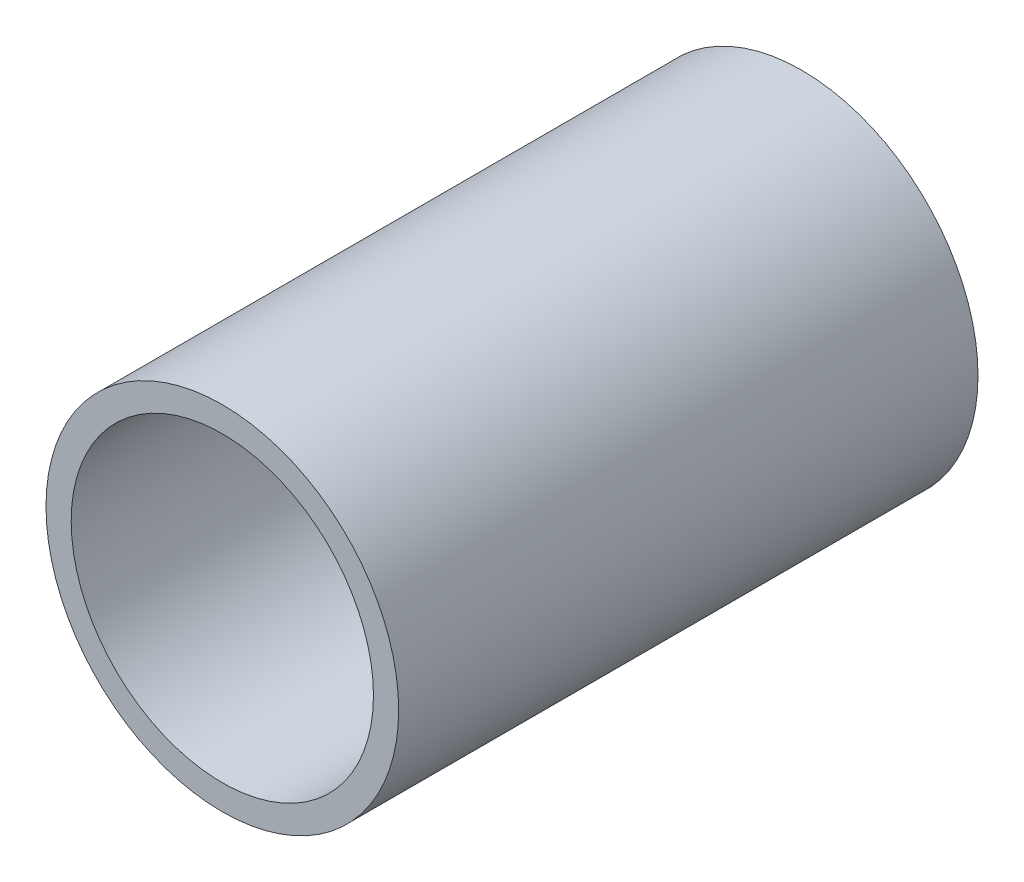
ISO-10303-21;
HEADER;
FILE_DESCRIPTION(('STEP AP214'),'2;1');
FILE_NAME('part.step','',(''),(''),'','','');
FILE_SCHEMA(('AUTOMOTIVE_DESIGN { 1 0 10303 214 1 1 1 1 }'));
ENDSEC;
DATA;
#1=APPLICATION_CONTEXT('core data for automotive mechanical design processes');
#2=APPLICATION_PROTOCOL_DEFINITION('international standard','automotive_design',2000,#1);
#3=PRODUCT_CONTEXT('',#1,'mechanical');
#4=PRODUCT('Part','Part','',(#3));
#5=PRODUCT_RELATED_PRODUCT_CATEGORY('part','',(#4));
#6=PRODUCT_DEFINITION_FORMATION('','',#4);
#7=PRODUCT_DEFINITION_CONTEXT('part definition',#1,'design');
#8=PRODUCT_DEFINITION('design','',#6,#7);
#9=PRODUCT_DEFINITION_SHAPE('','',#8);
#10=(LENGTH_UNIT() NAMED_UNIT(*) SI_UNIT(.MILLI.,.METRE.));
#11=(NAMED_UNIT(*) PLANE_ANGLE_UNIT() SI_UNIT($,.RADIAN.));
#12=(NAMED_UNIT(*) SI_UNIT($,.STERADIAN.) SOLID_ANGLE_UNIT());
#13=UNCERTAINTY_MEASURE_WITH_UNIT(LENGTH_MEASURE(1.E-05),#10,'distance_accuracy_value','');
#14=(GEOMETRIC_REPRESENTATION_CONTEXT(3) GLOBAL_UNCERTAINTY_ASSIGNED_CONTEXT((#13)) GLOBAL_UNIT_ASSIGNED_CONTEXT((#10,
#11,#12)) REPRESENTATION_CONTEXT('',''));
#15=CARTESIAN_POINT('',(0.,0.,0.));
#16=DIRECTION('',(0.,0.,1.));
#17=DIRECTION('',(1.,0.,0.));
#18=AXIS2_PLACEMENT_3D('',#15,#16,#17);
#19=CARTESIAN_POINT('',(0.,0.,914.4));
#20=DIRECTION('',(0.,0.,-1.));
#21=DIRECTION('',(-1.,0.,0.));
#22=AXIS2_PLACEMENT_3D('',#19,#20,#21);
#23=CYLINDRICAL_SURFACE('',#22,22.225);
#24=CARTESIAN_POINT('',(0.,0.,-914.4));
#25=DIRECTION('',(0.,0.,1.));
#26=DIRECTION('',(1.,0.,0.));
#27=AXIS2_PLACEMENT_3D('',#24,#25,#26);
#28=CIRCLE('',#27,22.225);
#29=CARTESIAN_POINT('',(-22.225,0.,-914.4));
#30=VERTEX_POINT('',#29);
#31=EDGE_CURVE('E11',#30,#30,#28,.T.);
#32=CARTESIAN_POINT('',(0.,0.,-841.375));
#33=DIRECTION('',(0.,0.,1.));
#34=DIRECTION('',(1.,0.,0.));
#35=AXIS2_PLACEMENT_3D('',#32,#33,#34);
#36=CIRCLE('',#35,22.225);
#37=CARTESIAN_POINT('',(-22.225,0.,-841.375));
#38=VERTEX_POINT('',#37);
#39=EDGE_CURVE('E50',#38,#38,#36,.F.);
#40=CARTESIAN_POINT('',(-22.225,0.,-914.4));
#41=CARTESIAN_POINT('',(-22.225,0.,-913.639322916667));
#42=CARTESIAN_POINT('',(-22.225,0.,-912.878645833334));
#43=CARTESIAN_POINT('',(-22.225,0.,-911.357291666667));
#44=CARTESIAN_POINT('',(-22.225,0.,-910.596614583334));
#45=CARTESIAN_POINT('',(-22.225,0.,-909.075260416667));
#46=CARTESIAN_POINT('',(-22.225,0.,-908.314583333334));
#47=CARTESIAN_POINT('',(-22.225,0.,-906.793229166667));
#48=CARTESIAN_POINT('',(-22.225,0.,-906.032552083334));
#49=CARTESIAN_POINT('',(-22.225,0.,-904.511197916667));
#50=CARTESIAN_POINT('',(-22.225,0.,-903.750520833334));
#51=CARTESIAN_POINT('',(-22.225,0.,-902.229166666667));
#52=CARTESIAN_POINT('',(-22.225,0.,-901.468489583334));
#53=CARTESIAN_POINT('',(-22.225,0.,-899.947135416667));
#54=CARTESIAN_POINT('',(-22.225,0.,-899.186458333334));
#55=CARTESIAN_POINT('',(-22.225,0.,-897.665104166667));
#56=CARTESIAN_POINT('',(-22.225,0.,-896.904427083334));
#57=CARTESIAN_POINT('',(-22.225,0.,-895.383072916667));
#58=CARTESIAN_POINT('',(-22.225,0.,-894.622395833334));
#59=CARTESIAN_POINT('',(-22.225,0.,-893.101041666667));
#60=CARTESIAN_POINT('',(-22.225,0.,-892.340364583334));
#61=CARTESIAN_POINT('',(-22.225,0.,-890.819010416667));
#62=CARTESIAN_POINT('',(-22.225,0.,-890.058333333334));
#63=CARTESIAN_POINT('',(-22.225,0.,-888.536979166667));
#64=CARTESIAN_POINT('',(-22.225,0.,-887.776302083334));
#65=CARTESIAN_POINT('',(-22.225,0.,-886.254947916667));
#66=CARTESIAN_POINT('',(-22.225,0.,-885.494270833334));
#67=CARTESIAN_POINT('',(-22.225,0.,-883.972916666667));
#68=CARTESIAN_POINT('',(-22.225,0.,-883.212239583334));
#69=CARTESIAN_POINT('',(-22.225,0.,-881.690885416667));
#70=CARTESIAN_POINT('',(-22.225,0.,-880.930208333334));
#71=CARTESIAN_POINT('',(-22.225,0.,-879.408854166667));
#72=CARTESIAN_POINT('',(-22.225,0.,-878.648177083334));
#73=CARTESIAN_POINT('',(-22.225,0.,-877.126822916667));
#74=CARTESIAN_POINT('',(-22.225,0.,-876.366145833333));
#75=CARTESIAN_POINT('',(-22.225,0.,-874.844791666667));
#76=CARTESIAN_POINT('',(-22.225,0.,-874.084114583333));
#77=CARTESIAN_POINT('',(-22.225,0.,-872.562760416667));
#78=CARTESIAN_POINT('',(-22.225,0.,-871.802083333333));
#79=CARTESIAN_POINT('',(-22.225,0.,-870.280729166667));
#80=CARTESIAN_POINT('',(-22.225,0.,-869.520052083333));
#81=CARTESIAN_POINT('',(-22.225,0.,-867.998697916667));
#82=CARTESIAN_POINT('',(-22.225,0.,-867.238020833334));
#83=CARTESIAN_POINT('',(-22.225,0.,-865.716666666667));
#84=CARTESIAN_POINT('',(-22.225,0.,-864.955989583334));
#85=CARTESIAN_POINT('',(-22.225,0.,-863.434635416667));
#86=CARTESIAN_POINT('',(-22.225,0.,-862.673958333334));
#87=CARTESIAN_POINT('',(-22.225,0.,-861.152604166667));
#88=CARTESIAN_POINT('',(-22.225,0.,-860.391927083333));
#89=CARTESIAN_POINT('',(-22.225,0.,-858.870572916667));
#90=CARTESIAN_POINT('',(-22.225,0.,-858.109895833333));
#91=CARTESIAN_POINT('',(-22.225,0.,-856.588541666667));
#92=CARTESIAN_POINT('',(-22.225,0.,-855.827864583333));
#93=CARTESIAN_POINT('',(-22.225,0.,-854.306510416667));
#94=CARTESIAN_POINT('',(-22.225,0.,-853.545833333333));
#95=CARTESIAN_POINT('',(-22.225,0.,-852.024479166667));
#96=CARTESIAN_POINT('',(-22.225,0.,-851.263802083333));
#97=CARTESIAN_POINT('',(-22.225,0.,-849.742447916667));
#98=CARTESIAN_POINT('',(-22.225,0.,-848.981770833333));
#99=CARTESIAN_POINT('',(-22.225,0.,-847.460416666667));
#100=CARTESIAN_POINT('',(-22.225,0.,-846.699739583333));
#101=CARTESIAN_POINT('',(-22.225,0.,-845.178385416667));
#102=CARTESIAN_POINT('',(-22.225,0.,-844.417708333333));
#103=CARTESIAN_POINT('',(-22.225,0.,-842.896354166667));
#104=CARTESIAN_POINT('',(-22.225,0.,-842.135677083333));
#105=CARTESIAN_POINT('',(-22.225,0.,-841.375));
#106=B_SPLINE_CURVE_WITH_KNOTS('',3,(#40,#41,#42,#43,#44,#45,#46,#47,#48,#49,#50,#51,#52,#53,
#54,#55,#56,#57,#58,#59,#60,#61,#62,#63,#64,#65,#66,#67,#68,#69,#70,#71,#72,#73,#74,#75,#76,#77,
#78,#79,#80,#81,#82,#83,#84,#85,#86,#87,#88,#89,#90,#91,#92,#93,#94,#95,#96,#97,#98,#99,#100,
#101,#102,#103,#104,#105),.UNSPECIFIED.,.F.,.F.,(4,2,2,2,2,2,2,2,2,2,2,2,2,2,2,2,2,2,2,2,2,2,2,
2,2,2,2,2,2,2,2,2,4),(0.,2.28203125000004,4.56406250000008,6.84609375000012,9.12812500000015,
11.41015625,13.6921875,15.97421875,18.2562500000001,20.5382812500001,22.8203125000002,
25.1023437500002,27.384375,29.6664062500001,31.9484375000001,34.2304687500001,36.5125000000002,
38.7945312500002,41.0765625000003,43.3585937500003,45.6406250000003,47.9226562500001,
50.2046875000002,52.4867187500002,54.7687500000003,57.0507812500003,59.3328125000003,
61.6148437500004,63.8968750000002,66.1789062500002,68.4609375000003,70.7429687500003,
73.0250000000003),.UNSPECIFIED.);
#107=EDGE_CURVE('BSEAM37',#30,#38,#106,.T.);
#108=ORIENTED_EDGE('',*,*,#31,.T.);
#109=ORIENTED_EDGE('',*,*,#39,.T.);
#110=ORIENTED_EDGE('',*,*,#107,.T.);
#111=ORIENTED_EDGE('',*,*,#107,.F.);
#112=EDGE_LOOP('',(#108,#110,#109,#111));
#113=FACE_BOUND('',#112,.T.);
#114=ADVANCED_FACE('F37',(#113),#23,.T.);
#115=CARTESIAN_POINT('',(0.,0.,914.4));
#116=DIRECTION('',(0.,0.,-1.));
#117=DIRECTION('',(-1.,0.,0.));
#118=AXIS2_PLACEMENT_3D('',#115,#116,#117);
#119=CYLINDRICAL_SURFACE('',#118,19.05);
#120=CARTESIAN_POINT('',(0.,0.,-914.4));
#121=DIRECTION('',(0.,0.,1.));
#122=DIRECTION('',(1.,0.,0.));
#123=AXIS2_PLACEMENT_3D('',#120,#121,#122);
#124=CIRCLE('',#123,19.05);
#125=CARTESIAN_POINT('',(-19.05,0.,-914.4));
#126=VERTEX_POINT('',#125);
#127=EDGE_CURVE('E44',#126,#126,#124,.T.);
#128=CARTESIAN_POINT('',(0.,0.,-841.375));
#129=DIRECTION('',(0.,0.,1.));
#130=DIRECTION('',(1.,0.,0.));
#131=AXIS2_PLACEMENT_3D('',#128,#129,#130);
#132=CIRCLE('',#131,19.05);
#133=CARTESIAN_POINT('',(-19.05,0.,-841.375));
#134=VERTEX_POINT('',#133);
#135=EDGE_CURVE('E40',#134,#134,#132,.T.);
#136=CARTESIAN_POINT('',(-19.05,0.,-914.4));
#137=CARTESIAN_POINT('',(-19.05,0.,-913.639322916667));
#138=CARTESIAN_POINT('',(-19.05,0.,-912.878645833334));
#139=CARTESIAN_POINT('',(-19.05,0.,-911.357291666667));
#140=CARTESIAN_POINT('',(-19.05,0.,-910.596614583334));
#141=CARTESIAN_POINT('',(-19.05,0.,-909.075260416667));
#142=CARTESIAN_POINT('',(-19.05,0.,-908.314583333334));
#143=CARTESIAN_POINT('',(-19.05,0.,-906.793229166667));
#144=CARTESIAN_POINT('',(-19.05,0.,-906.032552083334));
#145=CARTESIAN_POINT('',(-19.05,0.,-904.511197916667));
#146=CARTESIAN_POINT('',(-19.05,0.,-903.750520833334));
#147=CARTESIAN_POINT('',(-19.05,0.,-902.229166666667));
#148=CARTESIAN_POINT('',(-19.05,0.,-901.468489583334));
#149=CARTESIAN_POINT('',(-19.05,0.,-899.947135416667));
#150=CARTESIAN_POINT('',(-19.05,0.,-899.186458333334));
#151=CARTESIAN_POINT('',(-19.05,0.,-897.665104166667));
#152=CARTESIAN_POINT('',(-19.05,0.,-896.904427083334));
#153=CARTESIAN_POINT('',(-19.05,0.,-895.383072916667));
#154=CARTESIAN_POINT('',(-19.05,0.,-894.622395833334));
#155=CARTESIAN_POINT('',(-19.05,0.,-893.101041666667));
#156=CARTESIAN_POINT('',(-19.05,0.,-892.340364583334));
#157=CARTESIAN_POINT('',(-19.05,0.,-890.819010416667));
#158=CARTESIAN_POINT('',(-19.05,0.,-890.058333333334));
#159=CARTESIAN_POINT('',(-19.05,0.,-888.536979166667));
#160=CARTESIAN_POINT('',(-19.05,0.,-887.776302083334));
#161=CARTESIAN_POINT('',(-19.05,0.,-886.254947916667));
#162=CARTESIAN_POINT('',(-19.05,0.,-885.494270833334));
#163=CARTESIAN_POINT('',(-19.05,0.,-883.972916666667));
#164=CARTESIAN_POINT('',(-19.05,0.,-883.212239583334));
#165=CARTESIAN_POINT('',(-19.05,0.,-881.690885416667));
#166=CARTESIAN_POINT('',(-19.05,0.,-880.930208333334));
#167=CARTESIAN_POINT('',(-19.05,0.,-879.408854166667));
#168=CARTESIAN_POINT('',(-19.05,0.,-878.648177083334));
#169=CARTESIAN_POINT('',(-19.05,0.,-877.126822916667));
#170=CARTESIAN_POINT('',(-19.05,0.,-876.366145833334));
#171=CARTESIAN_POINT('',(-19.05,0.,-874.844791666667));
#172=CARTESIAN_POINT('',(-19.05,0.,-874.084114583334));
#173=CARTESIAN_POINT('',(-19.05,0.,-872.562760416667));
#174=CARTESIAN_POINT('',(-19.05,0.,-871.802083333334));
#175=CARTESIAN_POINT('',(-19.05,0.,-870.280729166667));
#176=CARTESIAN_POINT('',(-19.05,0.,-869.520052083334));
#177=CARTESIAN_POINT('',(-19.05,0.,-867.998697916667));
#178=CARTESIAN_POINT('',(-19.05,0.,-867.238020833334));
#179=CARTESIAN_POINT('',(-19.05,0.,-865.716666666667));
#180=CARTESIAN_POINT('',(-19.05,0.,-864.955989583334));
#181=CARTESIAN_POINT('',(-19.05,0.,-863.434635416667));
#182=CARTESIAN_POINT('',(-19.05,0.,-862.673958333334));
#183=CARTESIAN_POINT('',(-19.05,0.,-861.152604166667));
#184=CARTESIAN_POINT('',(-19.05,0.,-860.391927083334));
#185=CARTESIAN_POINT('',(-19.05,0.,-858.870572916667));
#186=CARTESIAN_POINT('',(-19.05,0.,-858.109895833334));
#187=CARTESIAN_POINT('',(-19.05,0.,-856.588541666667));
#188=CARTESIAN_POINT('',(-19.05,0.,-855.827864583334));
#189=CARTESIAN_POINT('',(-19.05,0.,-854.306510416667));
#190=CARTESIAN_POINT('',(-19.05,0.,-853.545833333334));
#191=CARTESIAN_POINT('',(-19.05,0.,-852.024479166667));
#192=CARTESIAN_POINT('',(-19.05,0.,-851.263802083334));
#193=CARTESIAN_POINT('',(-19.05,0.,-849.742447916667));
#194=CARTESIAN_POINT('',(-19.05,0.,-848.981770833334));
#195=CARTESIAN_POINT('',(-19.05,0.,-847.460416666667));
#196=CARTESIAN_POINT('',(-19.05,0.,-846.699739583334));
#197=CARTESIAN_POINT('',(-19.05,0.,-845.178385416667));
#198=CARTESIAN_POINT('',(-19.05,0.,-844.417708333334));
#199=CARTESIAN_POINT('',(-19.05,0.,-842.896354166667));
#200=CARTESIAN_POINT('',(-19.05,0.,-842.135677083334));
#201=CARTESIAN_POINT('',(-19.05,0.,-841.375));
#202=B_SPLINE_CURVE_WITH_KNOTS('',3,(#136,#137,#138,#139,#140,#141,#142,#143,#144,#145,#146,
#147,#148,#149,#150,#151,#152,#153,#154,#155,#156,#157,#158,#159,#160,#161,#162,#163,#164,#165,
#166,#167,#168,#169,#170,#171,#172,#173,#174,#175,#176,#177,#178,#179,#180,#181,#182,#183,#184,
#185,#186,#187,#188,#189,#190,#191,#192,#193,#194,#195,#196,#197,#198,#199,#200,#201),
.UNSPECIFIED.,.F.,.F.,(4,2,2,2,2,2,2,2,2,2,2,2,2,2,2,2,2,2,2,2,2,2,2,2,2,2,2,2,2,2,2,2,4),(0.,
2.28203125000004,4.56406250000008,6.84609374999989,9.12812499999993,11.41015625,13.6921875,
15.97421875,18.2562499999999,20.5382812499999,22.8203124999999,25.10234375,27.384375,
29.6664062500001,31.9484374999999,34.2304687499999,36.5124999999999,38.79453125,41.0765625,
43.3585937499998,45.6406249999999,47.9226562499999,50.2046875,52.48671875,54.76875,
57.0507812499999,59.3328124999999,61.6148437499999,63.896875,66.17890625,68.4609374999998,
70.7429687499999,73.0249999999999),.UNSPECIFIED.);
#203=EDGE_CURVE('BSEAM57',#126,#134,#202,.T.);
#204=ORIENTED_EDGE('',*,*,#127,.F.);
#205=ORIENTED_EDGE('',*,*,#135,.T.);
#206=ORIENTED_EDGE('',*,*,#203,.T.);
#207=ORIENTED_EDGE('',*,*,#203,.F.);
#208=EDGE_LOOP('',(#204,#206,#205,#207));
#209=FACE_BOUND('',#208,.T.);
#210=ADVANCED_FACE('F57',(#209),#119,.F.);
#211=CARTESIAN_POINT('',(0.,0.,-914.4));
#212=DIRECTION('',(0.,0.,1.));
#213=DIRECTION('',(1.,0.,0.));
#214=AXIS2_PLACEMENT_3D('',#211,#212,#213);
#215=PLANE('',#214);
#216=ORIENTED_EDGE('',*,*,#127,.T.);
#217=EDGE_LOOP('',(#216));
#218=FACE_BOUND('',#217,.T.);
#219=ORIENTED_EDGE('',*,*,#31,.F.);
#220=EDGE_LOOP('',(#219));
#221=FACE_BOUND('',#220,.T.);
#222=ADVANCED_FACE('F62',(#218,#221),#215,.F.);
#223=CARTESIAN_POINT('',(0.,0.,-841.375));
#224=DIRECTION('',(0.,0.,1.));
#225=DIRECTION('',(1.,0.,0.));
#226=AXIS2_PLACEMENT_3D('',#223,#224,#225);
#227=PLANE('',#226);
#228=ORIENTED_EDGE('',*,*,#135,.F.);
#229=EDGE_LOOP('',(#228));
#230=FACE_BOUND('',#229,.T.);
#231=ORIENTED_EDGE('',*,*,#39,.F.);
#232=EDGE_LOOP('',(#231));
#233=FACE_BOUND('',#232,.T.);
#234=ADVANCED_FACE('F59',(#230,#233),#227,.T.);
#235=CLOSED_SHELL('',(#114,#210,#222,#234));
#236=MANIFOLD_SOLID_BREP('B2',#235);
#237=ADVANCED_BREP_SHAPE_REPRESENTATION('',(#18,#236),#14);
#238=SHAPE_DEFINITION_REPRESENTATION(#9,#237);
ENDSEC;
END-ISO-10303-21;
